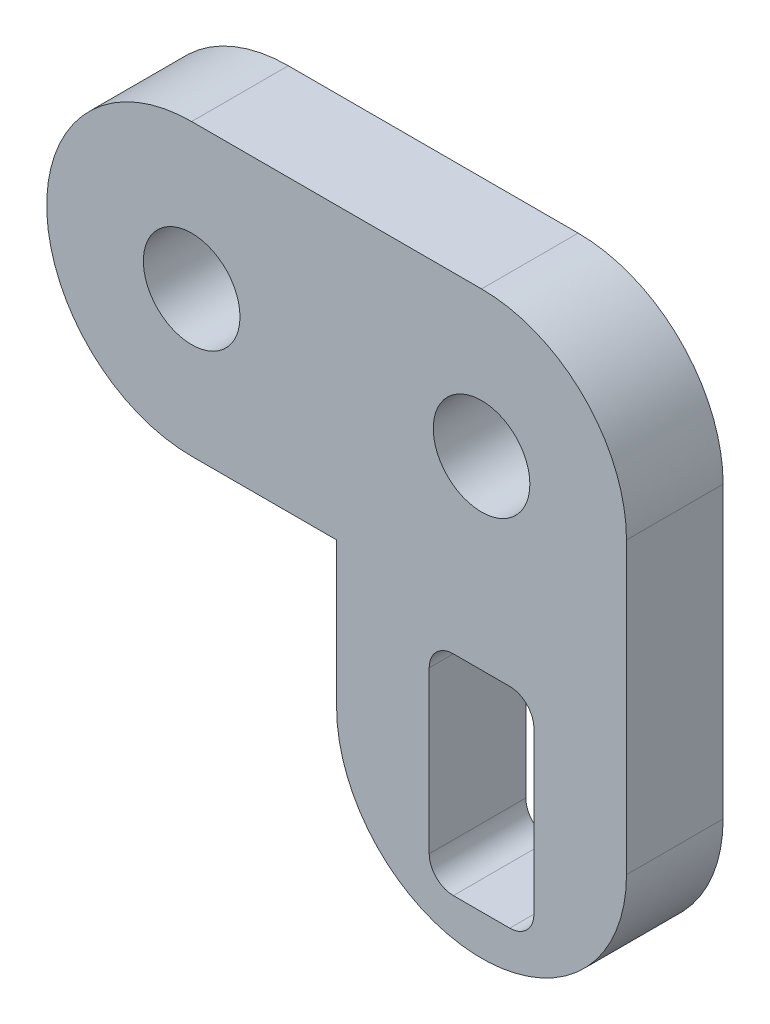
ISO-10303-21;
HEADER;
FILE_DESCRIPTION(('STEP AP214'),'2;1');
FILE_NAME('part.step','',(''),(''),'','','');
FILE_SCHEMA(('AUTOMOTIVE_DESIGN { 1 0 10303 214 1 1 1 1 }'));
ENDSEC;
DATA;
#1=APPLICATION_CONTEXT('core data for automotive mechanical design processes');
#2=APPLICATION_PROTOCOL_DEFINITION('international standard','automotive_design',2000,#1);
#3=PRODUCT_CONTEXT('',#1,'mechanical');
#4=PRODUCT('Part','Part','',(#3));
#5=PRODUCT_RELATED_PRODUCT_CATEGORY('part','',(#4));
#6=PRODUCT_DEFINITION_FORMATION('','',#4);
#7=PRODUCT_DEFINITION_CONTEXT('part definition',#1,'design');
#8=PRODUCT_DEFINITION('design','',#6,#7);
#9=PRODUCT_DEFINITION_SHAPE('','',#8);
#10=(LENGTH_UNIT() NAMED_UNIT(*) SI_UNIT(.MILLI.,.METRE.));
#11=(NAMED_UNIT(*) PLANE_ANGLE_UNIT() SI_UNIT($,.RADIAN.));
#12=(NAMED_UNIT(*) SI_UNIT($,.STERADIAN.) SOLID_ANGLE_UNIT());
#13=UNCERTAINTY_MEASURE_WITH_UNIT(LENGTH_MEASURE(1.E-05),#10,'distance_accuracy_value','');
#14=(GEOMETRIC_REPRESENTATION_CONTEXT(3) GLOBAL_UNCERTAINTY_ASSIGNED_CONTEXT((#13)) GLOBAL_UNIT_ASSIGNED_CONTEXT((#10,
#11,#12)) REPRESENTATION_CONTEXT('',''));
#15=CARTESIAN_POINT('',(0.,0.,0.));
#16=DIRECTION('',(0.,0.,1.));
#17=DIRECTION('',(1.,0.,0.));
#18=AXIS2_PLACEMENT_3D('',#15,#16,#17);
#19=CARTESIAN_POINT('',(149.3421335095,207.323953209,3.));
#20=DIRECTION('',(0.,0.,1.));
#21=DIRECTION('',(1.,0.,0.));
#22=AXIS2_PLACEMENT_3D('',#19,#20,#21);
#23=PLANE('',#22);
#24=CARTESIAN_POINT('',(158.3421335095,207.323953209,3.));
#25=DIRECTION('',(0.,0.,1.));
#26=DIRECTION('',(1.,0.,0.));
#27=AXIS2_PLACEMENT_3D('',#24,#25,#26);
#28=CIRCLE('',#27,1.5);
#29=CARTESIAN_POINT('',(159.8421335095,207.323953209,3.));
#30=VERTEX_POINT('',#29);
#31=EDGE_CURVE('E205',#30,#30,#28,.T.);
#32=ORIENTED_EDGE('',*,*,#31,.F.);
#33=EDGE_LOOP('',(#32));
#34=FACE_BOUND('',#33,.T.);
#35=CARTESIAN_POINT('',(149.3421335095,207.323953209,3.));
#36=DIRECTION('',(0.,0.,1.));
#37=DIRECTION('',(1.,0.,0.));
#38=AXIS2_PLACEMENT_3D('',#35,#36,#37);
#39=CIRCLE('',#38,4.49999999999999);
#40=CARTESIAN_POINT('',(149.3421335095,211.823953209,3.));
#41=VERTEX_POINT('',#40);
#42=CARTESIAN_POINT('',(149.3421335095,202.823953209,3.));
#43=VERTEX_POINT('',#42);
#44=EDGE_CURVE('E217',#41,#43,#39,.T.);
#45=ORIENTED_EDGE('',*,*,#44,.T.);
#46=DIRECTION('',(1.,0.,0.));
#47=VECTOR('',#46,1.);
#48=CARTESIAN_POINT('',(153.8421335095,202.823953209,3.));
#49=LINE('',#48,#47);
#50=CARTESIAN_POINT('',(153.8421335095,202.823953209,3.));
#51=VERTEX_POINT('',#50);
#52=EDGE_CURVE('E220',#43,#51,#49,.T.);
#53=ORIENTED_EDGE('',*,*,#52,.T.);
#54=DIRECTION('',(0.,-1.,0.));
#55=VECTOR('',#54,1.);
#56=CARTESIAN_POINT('',(153.8421335095,198.323953209,3.));
#57=LINE('',#56,#55);
#58=CARTESIAN_POINT('',(153.8421335095,198.323953209,3.));
#59=VERTEX_POINT('',#58);
#60=EDGE_CURVE('E223',#51,#59,#57,.T.);
#61=ORIENTED_EDGE('',*,*,#60,.T.);
#62=CARTESIAN_POINT('',(158.3421335095,198.323953209,3.));
#63=DIRECTION('',(0.,0.,1.));
#64=DIRECTION('',(1.,0.,0.));
#65=AXIS2_PLACEMENT_3D('',#62,#63,#64);
#66=CIRCLE('',#65,4.49999999999999);
#67=CARTESIAN_POINT('',(162.8421335095,198.323953209,3.));
#68=VERTEX_POINT('',#67);
#69=EDGE_CURVE('E225',#59,#68,#66,.T.);
#70=ORIENTED_EDGE('',*,*,#69,.T.);
#71=DIRECTION('',(0.,1.,0.));
#72=VECTOR('',#71,1.);
#73=CARTESIAN_POINT('',(162.8421335095,198.323953209,3.));
#74=LINE('',#73,#72);
#75=CARTESIAN_POINT('',(162.8421335095,207.323953209,3.));
#76=VERTEX_POINT('',#75);
#77=EDGE_CURVE('E227',#68,#76,#74,.T.);
#78=ORIENTED_EDGE('',*,*,#77,.T.);
#79=CARTESIAN_POINT('',(158.3421335095,207.323953209,3.));
#80=DIRECTION('',(0.,0.,1.));
#81=DIRECTION('',(1.,0.,0.));
#82=AXIS2_PLACEMENT_3D('',#79,#80,#81);
#83=CIRCLE('',#82,4.5);
#84=CARTESIAN_POINT('',(158.3421335095,211.823953209,3.));
#85=VERTEX_POINT('',#84);
#86=EDGE_CURVE('E229',#76,#85,#83,.T.);
#87=ORIENTED_EDGE('',*,*,#86,.T.);
#88=DIRECTION('',(-1.,0.,0.));
#89=VECTOR('',#88,1.);
#90=CARTESIAN_POINT('',(149.3421335095,211.823953209,3.));
#91=LINE('',#90,#89);
#92=EDGE_CURVE('E231',#85,#41,#91,.T.);
#93=ORIENTED_EDGE('',*,*,#92,.T.);
#94=EDGE_LOOP('',(#45,#53,#61,#70,#78,#87,#93));
#95=FACE_BOUND('',#94,.T.);
#96=CARTESIAN_POINT('',(149.3421335095,207.323953209,3.));
#97=DIRECTION('',(0.,0.,1.));
#98=DIRECTION('',(1.,0.,0.));
#99=AXIS2_PLACEMENT_3D('',#96,#97,#98);
#100=CIRCLE('',#99,1.5);
#101=CARTESIAN_POINT('',(150.8421335095,207.323953209,3.));
#102=VERTEX_POINT('',#101);
#103=EDGE_CURVE('E211',#102,#102,#100,.T.);
#104=ORIENTED_EDGE('',*,*,#103,.F.);
#105=EDGE_LOOP('',(#104));
#106=FACE_BOUND('',#105,.T.);
#107=DIRECTION('',(0.,-1.,0.));
#108=VECTOR('',#107,1.);
#109=CARTESIAN_POINT('',(156.7171335095,195.823953209,3.));
#110=LINE('',#109,#108);
#111=CARTESIAN_POINT('',(156.7171335095,200.823953209,3.));
#112=VERTEX_POINT('',#111);
#113=CARTESIAN_POINT('',(156.7171335095,195.823953209,3.));
#114=VERTEX_POINT('',#113);
#115=EDGE_CURVE('E148',#112,#114,#110,.T.);
#116=ORIENTED_EDGE('',*,*,#115,.F.);
#117=CARTESIAN_POINT('',(157.4671335095,200.823953209,3.));
#118=DIRECTION('',(0.,0.,1.));
#119=DIRECTION('',(1.,0.,0.));
#120=AXIS2_PLACEMENT_3D('',#117,#118,#119);
#121=CIRCLE('',#120,0.750000000000001);
#122=CARTESIAN_POINT('',(157.4671335095,201.573953209,3.));
#123=VERTEX_POINT('',#122);
#124=EDGE_CURVE('E140',#123,#112,#121,.T.);
#125=ORIENTED_EDGE('',*,*,#124,.F.);
#126=DIRECTION('',(-1.,0.,0.));
#127=VECTOR('',#126,1.);
#128=CARTESIAN_POINT('',(157.4671335095,201.573953209,3.));
#129=LINE('',#128,#127);
#130=CARTESIAN_POINT('',(159.2171335095,201.573953209,3.));
#131=VERTEX_POINT('',#130);
#132=EDGE_CURVE('E173',#131,#123,#129,.T.);
#133=ORIENTED_EDGE('',*,*,#132,.F.);
#134=CARTESIAN_POINT('',(159.2171335095,200.823953209,3.));
#135=DIRECTION('',(0.,0.,1.));
#136=DIRECTION('',(1.,0.,0.));
#137=AXIS2_PLACEMENT_3D('',#134,#135,#136);
#138=CIRCLE('',#137,0.750000000000001);
#139=CARTESIAN_POINT('',(159.9671335095,200.823953209,3.));
#140=VERTEX_POINT('',#139);
#141=EDGE_CURVE('E171',#140,#131,#138,.T.);
#142=ORIENTED_EDGE('',*,*,#141,.F.);
#143=DIRECTION('',(0.,1.,0.));
#144=VECTOR('',#143,1.);
#145=CARTESIAN_POINT('',(159.9671335095,200.823953209,3.));
#146=LINE('',#145,#144);
#147=CARTESIAN_POINT('',(159.9671335095,195.823953209,3.));
#148=VERTEX_POINT('',#147);
#149=EDGE_CURVE('E169',#148,#140,#146,.T.);
#150=ORIENTED_EDGE('',*,*,#149,.F.);
#151=CARTESIAN_POINT('',(159.2171335095,195.823953209,3.));
#152=DIRECTION('',(0.,0.,1.));
#153=DIRECTION('',(1.,0.,0.));
#154=AXIS2_PLACEMENT_3D('',#151,#152,#153);
#155=CIRCLE('',#154,0.750000000000001);
#156=CARTESIAN_POINT('',(159.2171335095,195.073953209,3.));
#157=VERTEX_POINT('',#156);
#158=EDGE_CURVE('E167',#157,#148,#155,.T.);
#159=ORIENTED_EDGE('',*,*,#158,.F.);
#160=DIRECTION('',(1.,0.,0.));
#161=VECTOR('',#160,1.);
#162=CARTESIAN_POINT('',(159.2171335095,195.073953209,3.));
#163=LINE('',#162,#161);
#164=CARTESIAN_POINT('',(157.4671335095,195.073953209,3.));
#165=VERTEX_POINT('',#164);
#166=EDGE_CURVE('E163',#165,#157,#163,.T.);
#167=ORIENTED_EDGE('',*,*,#166,.F.);
#168=CARTESIAN_POINT('',(157.4671335095,195.823953209,3.));
#169=DIRECTION('',(0.,0.,1.));
#170=DIRECTION('',(1.,0.,0.));
#171=AXIS2_PLACEMENT_3D('',#168,#169,#170);
#172=CIRCLE('',#171,0.750000000000001);
#173=EDGE_CURVE('E161',#114,#165,#172,.T.);
#174=ORIENTED_EDGE('',*,*,#173,.F.);
#175=EDGE_LOOP('',(#116,#125,#133,#142,#150,#159,#167,#174));
#176=FACE_BOUND('',#175,.T.);
#177=ADVANCED_FACE('F33',(#34,#95,#106,#176),#23,.T.);
#178=CARTESIAN_POINT('',(149.3421335095,207.323953209,0.));
#179=DIRECTION('',(0.,0.,1.));
#180=DIRECTION('',(1.,0.,0.));
#181=AXIS2_PLACEMENT_3D('',#178,#179,#180);
#182=PLANE('',#181);
#183=CARTESIAN_POINT('',(158.3421335095,207.323953209,0.));
#184=DIRECTION('',(0.,0.,1.));
#185=DIRECTION('',(1.,0.,0.));
#186=AXIS2_PLACEMENT_3D('',#183,#184,#185);
#187=CIRCLE('',#186,1.5);
#188=CARTESIAN_POINT('',(159.8421335095,207.323953209,0.));
#189=VERTEX_POINT('',#188);
#190=EDGE_CURVE('E156',#189,#189,#187,.T.);
#191=ORIENTED_EDGE('',*,*,#190,.T.);
#192=EDGE_LOOP('',(#191));
#193=FACE_BOUND('',#192,.T.);
#194=CARTESIAN_POINT('',(149.3421335095,207.323953209,0.));
#195=DIRECTION('',(0.,0.,1.));
#196=DIRECTION('',(1.,0.,0.));
#197=AXIS2_PLACEMENT_3D('',#194,#195,#196);
#198=CIRCLE('',#197,4.49999999999999);
#199=CARTESIAN_POINT('',(149.3421335095,211.823953209,0.));
#200=VERTEX_POINT('',#199);
#201=CARTESIAN_POINT('',(149.3421335095,202.823953209,0.));
#202=VERTEX_POINT('',#201);
#203=EDGE_CURVE('E214',#200,#202,#198,.T.);
#204=ORIENTED_EDGE('',*,*,#203,.F.);
#205=DIRECTION('',(-1.,0.,0.));
#206=VECTOR('',#205,1.);
#207=CARTESIAN_POINT('',(149.3421335095,211.823953209,0.));
#208=LINE('',#207,#206);
#209=CARTESIAN_POINT('',(158.3421335095,211.823953209,0.));
#210=VERTEX_POINT('',#209);
#211=EDGE_CURVE('E221',#210,#200,#208,.T.);
#212=ORIENTED_EDGE('',*,*,#211,.F.);
#213=CARTESIAN_POINT('',(158.3421335095,207.323953209,0.));
#214=DIRECTION('',(0.,0.,1.));
#215=DIRECTION('',(1.,0.,0.));
#216=AXIS2_PLACEMENT_3D('',#213,#214,#215);
#217=CIRCLE('',#216,4.5);
#218=CARTESIAN_POINT('',(162.8421335095,207.323953209,0.));
#219=VERTEX_POINT('',#218);
#220=EDGE_CURVE('E244',#219,#210,#217,.T.);
#221=ORIENTED_EDGE('',*,*,#220,.F.);
#222=DIRECTION('',(0.,1.,0.));
#223=VECTOR('',#222,1.);
#224=CARTESIAN_POINT('',(162.8421335095,198.323953209,0.));
#225=LINE('',#224,#223);
#226=CARTESIAN_POINT('',(162.8421335095,198.323953209,0.));
#227=VERTEX_POINT('',#226);
#228=EDGE_CURVE('E242',#227,#219,#225,.T.);
#229=ORIENTED_EDGE('',*,*,#228,.F.);
#230=CARTESIAN_POINT('',(158.3421335095,198.323953209,0.));
#231=DIRECTION('',(0.,0.,1.));
#232=DIRECTION('',(1.,0.,0.));
#233=AXIS2_PLACEMENT_3D('',#230,#231,#232);
#234=CIRCLE('',#233,4.49999999999999);
#235=CARTESIAN_POINT('',(153.8421335095,198.323953209,0.));
#236=VERTEX_POINT('',#235);
#237=EDGE_CURVE('E240',#236,#227,#234,.T.);
#238=ORIENTED_EDGE('',*,*,#237,.F.);
#239=DIRECTION('',(0.,-1.,0.));
#240=VECTOR('',#239,1.);
#241=CARTESIAN_POINT('',(153.8421335095,198.323953209,0.));
#242=LINE('',#241,#240);
#243=CARTESIAN_POINT('',(153.8421335095,202.823953209,0.));
#244=VERTEX_POINT('',#243);
#245=EDGE_CURVE('E238',#244,#236,#242,.T.);
#246=ORIENTED_EDGE('',*,*,#245,.F.);
#247=DIRECTION('',(1.,0.,0.));
#248=VECTOR('',#247,1.);
#249=CARTESIAN_POINT('',(153.8421335095,202.823953209,0.));
#250=LINE('',#249,#248);
#251=EDGE_CURVE('E236',#202,#244,#250,.T.);
#252=ORIENTED_EDGE('',*,*,#251,.F.);
#253=EDGE_LOOP('',(#204,#212,#221,#229,#238,#246,#252));
#254=FACE_BOUND('',#253,.T.);
#255=CARTESIAN_POINT('',(149.3421335095,207.323953209,0.));
#256=DIRECTION('',(0.,0.,1.));
#257=DIRECTION('',(1.,0.,0.));
#258=AXIS2_PLACEMENT_3D('',#255,#256,#257);
#259=CIRCLE('',#258,1.5);
#260=CARTESIAN_POINT('',(150.8421335095,207.323953209,0.));
#261=VERTEX_POINT('',#260);
#262=EDGE_CURVE('E208',#261,#261,#259,.T.);
#263=ORIENTED_EDGE('',*,*,#262,.T.);
#264=EDGE_LOOP('',(#263));
#265=FACE_BOUND('',#264,.T.);
#266=CARTESIAN_POINT('',(157.4671335095,200.823953209,0.));
#267=DIRECTION('',(0.,0.,1.));
#268=DIRECTION('',(1.,0.,0.));
#269=AXIS2_PLACEMENT_3D('',#266,#267,#268);
#270=CIRCLE('',#269,0.750000000000001);
#271=CARTESIAN_POINT('',(157.4671335095,201.573953209,0.));
#272=VERTEX_POINT('',#271);
#273=CARTESIAN_POINT('',(156.7171335095,200.823953209,0.));
#274=VERTEX_POINT('',#273);
#275=EDGE_CURVE('E56',#272,#274,#270,.T.);
#276=ORIENTED_EDGE('',*,*,#275,.T.);
#277=DIRECTION('',(0.,-1.,0.));
#278=VECTOR('',#277,1.);
#279=CARTESIAN_POINT('',(156.7171335095,195.823953209,0.));
#280=LINE('',#279,#278);
#281=CARTESIAN_POINT('',(156.7171335095,195.823953209,0.));
#282=VERTEX_POINT('',#281);
#283=EDGE_CURVE('E155',#274,#282,#280,.T.);
#284=ORIENTED_EDGE('',*,*,#283,.T.);
#285=CARTESIAN_POINT('',(157.4671335095,195.823953209,0.));
#286=DIRECTION('',(0.,0.,1.));
#287=DIRECTION('',(1.,0.,0.));
#288=AXIS2_PLACEMENT_3D('',#285,#286,#287);
#289=CIRCLE('',#288,0.750000000000001);
#290=CARTESIAN_POINT('',(157.4671335095,195.073953209,0.));
#291=VERTEX_POINT('',#290);
#292=EDGE_CURVE('E177',#282,#291,#289,.T.);
#293=ORIENTED_EDGE('',*,*,#292,.T.);
#294=DIRECTION('',(1.,0.,0.));
#295=VECTOR('',#294,1.);
#296=CARTESIAN_POINT('',(159.2171335095,195.073953209,0.));
#297=LINE('',#296,#295);
#298=CARTESIAN_POINT('',(159.2171335095,195.073953209,0.));
#299=VERTEX_POINT('',#298);
#300=EDGE_CURVE('E180',#291,#299,#297,.T.);
#301=ORIENTED_EDGE('',*,*,#300,.T.);
#302=CARTESIAN_POINT('',(159.2171335095,195.823953209,0.));
#303=DIRECTION('',(0.,0.,1.));
#304=DIRECTION('',(1.,0.,0.));
#305=AXIS2_PLACEMENT_3D('',#302,#303,#304);
#306=CIRCLE('',#305,0.750000000000001);
#307=CARTESIAN_POINT('',(159.9671335095,195.823953209,0.));
#308=VERTEX_POINT('',#307);
#309=EDGE_CURVE('E183',#299,#308,#306,.T.);
#310=ORIENTED_EDGE('',*,*,#309,.T.);
#311=DIRECTION('',(0.,1.,0.));
#312=VECTOR('',#311,1.);
#313=CARTESIAN_POINT('',(159.9671335095,200.823953209,0.));
#314=LINE('',#313,#312);
#315=CARTESIAN_POINT('',(159.9671335095,200.823953209,0.));
#316=VERTEX_POINT('',#315);
#317=EDGE_CURVE('E186',#308,#316,#314,.T.);
#318=ORIENTED_EDGE('',*,*,#317,.T.);
#319=CARTESIAN_POINT('',(159.2171335095,200.823953209,0.));
#320=DIRECTION('',(0.,0.,1.));
#321=DIRECTION('',(1.,0.,0.));
#322=AXIS2_PLACEMENT_3D('',#319,#320,#321);
#323=CIRCLE('',#322,0.750000000000001);
#324=CARTESIAN_POINT('',(159.2171335095,201.573953209,0.));
#325=VERTEX_POINT('',#324);
#326=EDGE_CURVE('E189',#316,#325,#323,.T.);
#327=ORIENTED_EDGE('',*,*,#326,.T.);
#328=DIRECTION('',(-1.,0.,0.));
#329=VECTOR('',#328,1.);
#330=CARTESIAN_POINT('',(157.4671335095,201.573953209,0.));
#331=LINE('',#330,#329);
#332=EDGE_CURVE('E149',#325,#272,#331,.T.);
#333=ORIENTED_EDGE('',*,*,#332,.T.);
#334=EDGE_LOOP('',(#276,#284,#293,#301,#310,#318,#327,#333));
#335=FACE_BOUND('',#334,.T.);
#336=ADVANCED_FACE('F271',(#193,#254,#265,#335),#182,.F.);
#337=CARTESIAN_POINT('',(149.3421335095,207.323953209,3.));
#338=DIRECTION('',(0.,0.,-1.));
#339=DIRECTION('',(-1.,0.,0.));
#340=AXIS2_PLACEMENT_3D('',#337,#338,#339);
#341=CYLINDRICAL_SURFACE('',#340,4.49999999999999);
#342=ORIENTED_EDGE('',*,*,#203,.T.);
#343=DIRECTION('',(0.,0.,-1.));
#344=VECTOR('',#343,1.);
#345=CARTESIAN_POINT('',(149.3421335095,202.823953209,3.));
#346=LINE('',#345,#344);
#347=EDGE_CURVE('E11',#43,#202,#346,.T.);
#348=ORIENTED_EDGE('',*,*,#347,.F.);
#349=ORIENTED_EDGE('',*,*,#44,.F.);
#350=DIRECTION('',(0.,0.,-1.));
#351=VECTOR('',#350,1.);
#352=CARTESIAN_POINT('',(149.3421335095,211.823953209,3.));
#353=LINE('',#352,#351);
#354=EDGE_CURVE('E233',#41,#200,#353,.T.);
#355=ORIENTED_EDGE('',*,*,#354,.T.);
#356=EDGE_LOOP('',(#342,#348,#349,#355));
#357=FACE_BOUND('',#356,.T.);
#358=ADVANCED_FACE('F35',(#357),#341,.T.);
#359=CARTESIAN_POINT('',(153.8421335095,202.823953209,3.));
#360=DIRECTION('',(0.,1.,0.));
#361=DIRECTION('',(0.,0.,1.));
#362=AXIS2_PLACEMENT_3D('',#359,#360,#361);
#363=PLANE('',#362);
#364=ORIENTED_EDGE('',*,*,#251,.T.);
#365=DIRECTION('',(0.,0.,-1.));
#366=VECTOR('',#365,1.);
#367=CARTESIAN_POINT('',(153.8421335095,202.823953209,3.));
#368=LINE('',#367,#366);
#369=EDGE_CURVE('E41',#51,#244,#368,.T.);
#370=ORIENTED_EDGE('',*,*,#369,.F.);
#371=ORIENTED_EDGE('',*,*,#52,.F.);
#372=ORIENTED_EDGE('',*,*,#347,.T.);
#373=EDGE_LOOP('',(#364,#370,#371,#372));
#374=FACE_BOUND('',#373,.T.);
#375=ADVANCED_FACE('F289',(#374),#363,.F.);
#376=CARTESIAN_POINT('',(153.8421335095,198.323953209,3.));
#377=DIRECTION('',(1.,0.,0.));
#378=DIRECTION('',(0.,0.,-1.));
#379=AXIS2_PLACEMENT_3D('',#376,#377,#378);
#380=PLANE('',#379);
#381=ORIENTED_EDGE('',*,*,#245,.T.);
#382=DIRECTION('',(0.,0.,-1.));
#383=VECTOR('',#382,1.);
#384=CARTESIAN_POINT('',(153.8421335095,198.323953209,3.));
#385=LINE('',#384,#383);
#386=EDGE_CURVE('E258',#59,#236,#385,.T.);
#387=ORIENTED_EDGE('',*,*,#386,.F.);
#388=ORIENTED_EDGE('',*,*,#60,.F.);
#389=ORIENTED_EDGE('',*,*,#369,.T.);
#390=EDGE_LOOP('',(#381,#387,#388,#389));
#391=FACE_BOUND('',#390,.T.);
#392=ADVANCED_FACE('F265',(#391),#380,.F.);
#393=CARTESIAN_POINT('',(158.3421335095,198.323953209,3.));
#394=DIRECTION('',(0.,0.,-1.));
#395=DIRECTION('',(-1.,0.,0.));
#396=AXIS2_PLACEMENT_3D('',#393,#394,#395);
#397=CYLINDRICAL_SURFACE('',#396,4.49999999999999);
#398=ORIENTED_EDGE('',*,*,#237,.T.);
#399=DIRECTION('',(0.,0.,-1.));
#400=VECTOR('',#399,1.);
#401=CARTESIAN_POINT('',(162.8421335095,198.323953209,3.));
#402=LINE('',#401,#400);
#403=EDGE_CURVE('E255',#68,#227,#402,.T.);
#404=ORIENTED_EDGE('',*,*,#403,.F.);
#405=ORIENTED_EDGE('',*,*,#69,.F.);
#406=ORIENTED_EDGE('',*,*,#386,.T.);
#407=EDGE_LOOP('',(#398,#404,#405,#406));
#408=FACE_BOUND('',#407,.T.);
#409=ADVANCED_FACE('F277',(#408),#397,.T.);
#410=CARTESIAN_POINT('',(162.8421335095,198.323953209,3.));
#411=DIRECTION('',(-1.,0.,0.));
#412=DIRECTION('',(0.,0.,1.));
#413=AXIS2_PLACEMENT_3D('',#410,#411,#412);
#414=PLANE('',#413);
#415=ORIENTED_EDGE('',*,*,#228,.T.);
#416=DIRECTION('',(0.,0.,-1.));
#417=VECTOR('',#416,1.);
#418=CARTESIAN_POINT('',(162.8421335095,207.323953209,3.));
#419=LINE('',#418,#417);
#420=EDGE_CURVE('E252',#76,#219,#419,.T.);
#421=ORIENTED_EDGE('',*,*,#420,.F.);
#422=ORIENTED_EDGE('',*,*,#77,.F.);
#423=ORIENTED_EDGE('',*,*,#403,.T.);
#424=EDGE_LOOP('',(#415,#421,#422,#423));
#425=FACE_BOUND('',#424,.T.);
#426=ADVANCED_FACE('F281',(#425),#414,.F.);
#427=CARTESIAN_POINT('',(158.3421335095,207.323953209,3.));
#428=DIRECTION('',(0.,0.,-1.));
#429=DIRECTION('',(-1.,0.,0.));
#430=AXIS2_PLACEMENT_3D('',#427,#428,#429);
#431=CYLINDRICAL_SURFACE('',#430,4.5);
#432=ORIENTED_EDGE('',*,*,#220,.T.);
#433=DIRECTION('',(0.,0.,-1.));
#434=VECTOR('',#433,1.);
#435=CARTESIAN_POINT('',(158.3421335095,211.823953209,3.));
#436=LINE('',#435,#434);
#437=EDGE_CURVE('E249',#85,#210,#436,.T.);
#438=ORIENTED_EDGE('',*,*,#437,.F.);
#439=ORIENTED_EDGE('',*,*,#86,.F.);
#440=ORIENTED_EDGE('',*,*,#420,.T.);
#441=EDGE_LOOP('',(#432,#438,#439,#440));
#442=FACE_BOUND('',#441,.T.);
#443=ADVANCED_FACE('F297',(#442),#431,.T.);
#444=CARTESIAN_POINT('',(149.3421335095,211.823953209,3.));
#445=DIRECTION('',(0.,-1.,0.));
#446=DIRECTION('',(0.,0.,-1.));
#447=AXIS2_PLACEMENT_3D('',#444,#445,#446);
#448=PLANE('',#447);
#449=ORIENTED_EDGE('',*,*,#211,.T.);
#450=ORIENTED_EDGE('',*,*,#354,.F.);
#451=ORIENTED_EDGE('',*,*,#92,.F.);
#452=ORIENTED_EDGE('',*,*,#437,.T.);
#453=EDGE_LOOP('',(#449,#450,#451,#452));
#454=FACE_BOUND('',#453,.T.);
#455=ADVANCED_FACE('F294',(#454),#448,.F.);
#456=CARTESIAN_POINT('',(149.3421335095,207.323953209,3.));
#457=DIRECTION('',(0.,0.,-1.));
#458=DIRECTION('',(-1.,0.,0.));
#459=AXIS2_PLACEMENT_3D('',#456,#457,#458);
#460=CYLINDRICAL_SURFACE('',#459,1.5);
#461=ORIENTED_EDGE('',*,*,#103,.T.);
#462=EDGE_LOOP('',(#461));
#463=FACE_BOUND('',#462,.T.);
#464=ORIENTED_EDGE('',*,*,#262,.F.);
#465=EDGE_LOOP('',(#464));
#466=FACE_BOUND('',#465,.T.);
#467=ADVANCED_FACE('F304',(#463,#466),#460,.F.);
#468=CARTESIAN_POINT('',(158.3421335095,207.323953209,3.));
#469=DIRECTION('',(0.,0.,-1.));
#470=DIRECTION('',(-1.,0.,0.));
#471=AXIS2_PLACEMENT_3D('',#468,#469,#470);
#472=CYLINDRICAL_SURFACE('',#471,1.5);
#473=ORIENTED_EDGE('',*,*,#31,.T.);
#474=EDGE_LOOP('',(#473));
#475=FACE_BOUND('',#474,.T.);
#476=ORIENTED_EDGE('',*,*,#190,.F.);
#477=EDGE_LOOP('',(#476));
#478=FACE_BOUND('',#477,.T.);
#479=ADVANCED_FACE('F319',(#475,#478),#472,.F.);
#480=CARTESIAN_POINT('',(157.4671335095,200.823953209,3.));
#481=DIRECTION('',(0.,0.,-1.));
#482=DIRECTION('',(-1.,0.,0.));
#483=AXIS2_PLACEMENT_3D('',#480,#481,#482);
#484=CYLINDRICAL_SURFACE('',#483,0.750000000000001);
#485=ORIENTED_EDGE('',*,*,#275,.F.);
#486=DIRECTION('',(0.,0.,-1.));
#487=VECTOR('',#486,1.);
#488=CARTESIAN_POINT('',(157.4671335095,201.573953209,3.));
#489=LINE('',#488,#487);
#490=EDGE_CURVE('E144',#123,#272,#489,.T.);
#491=ORIENTED_EDGE('',*,*,#490,.F.);
#492=ORIENTED_EDGE('',*,*,#124,.T.);
#493=DIRECTION('',(0.,0.,-1.));
#494=VECTOR('',#493,1.);
#495=CARTESIAN_POINT('',(156.7171335095,200.823953209,3.));
#496=LINE('',#495,#494);
#497=EDGE_CURVE('E143',#112,#274,#496,.T.);
#498=ORIENTED_EDGE('',*,*,#497,.T.);
#499=EDGE_LOOP('',(#485,#491,#492,#498));
#500=FACE_BOUND('',#499,.T.);
#501=ADVANCED_FACE('F142',(#500),#484,.F.);
#502=CARTESIAN_POINT('',(156.7171335095,195.823953209,3.));
#503=DIRECTION('',(1.,0.,0.));
#504=DIRECTION('',(0.,0.,-1.));
#505=AXIS2_PLACEMENT_3D('',#502,#503,#504);
#506=PLANE('',#505);
#507=ORIENTED_EDGE('',*,*,#283,.F.);
#508=ORIENTED_EDGE('',*,*,#497,.F.);
#509=ORIENTED_EDGE('',*,*,#115,.T.);
#510=DIRECTION('',(0.,0.,-1.));
#511=VECTOR('',#510,1.);
#512=CARTESIAN_POINT('',(156.7171335095,195.823953209,3.));
#513=LINE('',#512,#511);
#514=EDGE_CURVE('E157',#114,#282,#513,.T.);
#515=ORIENTED_EDGE('',*,*,#514,.T.);
#516=EDGE_LOOP('',(#507,#508,#509,#515));
#517=FACE_BOUND('',#516,.T.);
#518=ADVANCED_FACE('F152',(#517),#506,.T.);
#519=CARTESIAN_POINT('',(157.4671335095,195.823953209,3.));
#520=DIRECTION('',(0.,0.,-1.));
#521=DIRECTION('',(-1.,0.,0.));
#522=AXIS2_PLACEMENT_3D('',#519,#520,#521);
#523=CYLINDRICAL_SURFACE('',#522,0.750000000000001);
#524=ORIENTED_EDGE('',*,*,#292,.F.);
#525=ORIENTED_EDGE('',*,*,#514,.F.);
#526=ORIENTED_EDGE('',*,*,#173,.T.);
#527=DIRECTION('',(0.,0.,-1.));
#528=VECTOR('',#527,1.);
#529=CARTESIAN_POINT('',(157.4671335095,195.073953209,3.));
#530=LINE('',#529,#528);
#531=EDGE_CURVE('E202',#165,#291,#530,.T.);
#532=ORIENTED_EDGE('',*,*,#531,.T.);
#533=EDGE_LOOP('',(#524,#525,#526,#532));
#534=FACE_BOUND('',#533,.T.);
#535=ADVANCED_FACE('F328',(#534),#523,.F.);
#536=CARTESIAN_POINT('',(159.2171335095,195.073953209,3.));
#537=DIRECTION('',(0.,1.,0.));
#538=DIRECTION('',(0.,0.,1.));
#539=AXIS2_PLACEMENT_3D('',#536,#537,#538);
#540=PLANE('',#539);
#541=ORIENTED_EDGE('',*,*,#300,.F.);
#542=ORIENTED_EDGE('',*,*,#531,.F.);
#543=ORIENTED_EDGE('',*,*,#166,.T.);
#544=DIRECTION('',(0.,0.,-1.));
#545=VECTOR('',#544,1.);
#546=CARTESIAN_POINT('',(159.2171335095,195.073953209,3.));
#547=LINE('',#546,#545);
#548=EDGE_CURVE('E200',#157,#299,#547,.T.);
#549=ORIENTED_EDGE('',*,*,#548,.T.);
#550=EDGE_LOOP('',(#541,#542,#543,#549));
#551=FACE_BOUND('',#550,.T.);
#552=ADVANCED_FACE('F331',(#551),#540,.T.);
#553=CARTESIAN_POINT('',(159.2171335095,195.823953209,3.));
#554=DIRECTION('',(0.,0.,-1.));
#555=DIRECTION('',(-1.,0.,0.));
#556=AXIS2_PLACEMENT_3D('',#553,#554,#555);
#557=CYLINDRICAL_SURFACE('',#556,0.750000000000001);
#558=ORIENTED_EDGE('',*,*,#309,.F.);
#559=ORIENTED_EDGE('',*,*,#548,.F.);
#560=ORIENTED_EDGE('',*,*,#158,.T.);
#561=DIRECTION('',(0.,0.,-1.));
#562=VECTOR('',#561,1.);
#563=CARTESIAN_POINT('',(159.9671335095,195.823953209,3.));
#564=LINE('',#563,#562);
#565=EDGE_CURVE('E198',#148,#308,#564,.T.);
#566=ORIENTED_EDGE('',*,*,#565,.T.);
#567=EDGE_LOOP('',(#558,#559,#560,#566));
#568=FACE_BOUND('',#567,.T.);
#569=ADVANCED_FACE('F335',(#568),#557,.F.);
#570=CARTESIAN_POINT('',(159.9671335095,200.823953209,3.));
#571=DIRECTION('',(-1.,0.,0.));
#572=DIRECTION('',(0.,0.,1.));
#573=AXIS2_PLACEMENT_3D('',#570,#571,#572);
#574=PLANE('',#573);
#575=ORIENTED_EDGE('',*,*,#317,.F.);
#576=ORIENTED_EDGE('',*,*,#565,.F.);
#577=ORIENTED_EDGE('',*,*,#149,.T.);
#578=DIRECTION('',(0.,0.,-1.));
#579=VECTOR('',#578,1.);
#580=CARTESIAN_POINT('',(159.9671335095,200.823953209,3.));
#581=LINE('',#580,#579);
#582=EDGE_CURVE('E196',#140,#316,#581,.T.);
#583=ORIENTED_EDGE('',*,*,#582,.T.);
#584=EDGE_LOOP('',(#575,#576,#577,#583));
#585=FACE_BOUND('',#584,.T.);
#586=ADVANCED_FACE('F339',(#585),#574,.T.);
#587=CARTESIAN_POINT('',(159.2171335095,200.823953209,3.));
#588=DIRECTION('',(0.,0.,-1.));
#589=DIRECTION('',(-1.,0.,0.));
#590=AXIS2_PLACEMENT_3D('',#587,#588,#589);
#591=CYLINDRICAL_SURFACE('',#590,0.750000000000001);
#592=ORIENTED_EDGE('',*,*,#326,.F.);
#593=ORIENTED_EDGE('',*,*,#582,.F.);
#594=ORIENTED_EDGE('',*,*,#141,.T.);
#595=DIRECTION('',(0.,0.,-1.));
#596=VECTOR('',#595,1.);
#597=CARTESIAN_POINT('',(159.2171335095,201.573953209,3.));
#598=LINE('',#597,#596);
#599=EDGE_CURVE('E48',#131,#325,#598,.T.);
#600=ORIENTED_EDGE('',*,*,#599,.T.);
#601=EDGE_LOOP('',(#592,#593,#594,#600));
#602=FACE_BOUND('',#601,.T.);
#603=ADVANCED_FACE('F343',(#602),#591,.F.);
#604=CARTESIAN_POINT('',(157.4671335095,201.573953209,3.));
#605=DIRECTION('',(0.,-1.,0.));
#606=DIRECTION('',(0.,0.,-1.));
#607=AXIS2_PLACEMENT_3D('',#604,#605,#606);
#608=PLANE('',#607);
#609=ORIENTED_EDGE('',*,*,#332,.F.);
#610=ORIENTED_EDGE('',*,*,#599,.F.);
#611=ORIENTED_EDGE('',*,*,#132,.T.);
#612=ORIENTED_EDGE('',*,*,#490,.T.);
#613=EDGE_LOOP('',(#609,#610,#611,#612));
#614=FACE_BOUND('',#613,.T.);
#615=ADVANCED_FACE('F347',(#614),#608,.T.);
#616=CLOSED_SHELL('',(#177,#336,#358,#375,#392,#409,#426,#443,#455,#467,#479,#501,#518,#535,
#552,#569,#586,#603,#615));
#617=MANIFOLD_SOLID_BREP('B2',#616);
#618=ADVANCED_BREP_SHAPE_REPRESENTATION('',(#18,#617),#14);
#619=SHAPE_DEFINITION_REPRESENTATION(#9,#618);
ENDSEC;
END-ISO-10303-21;
